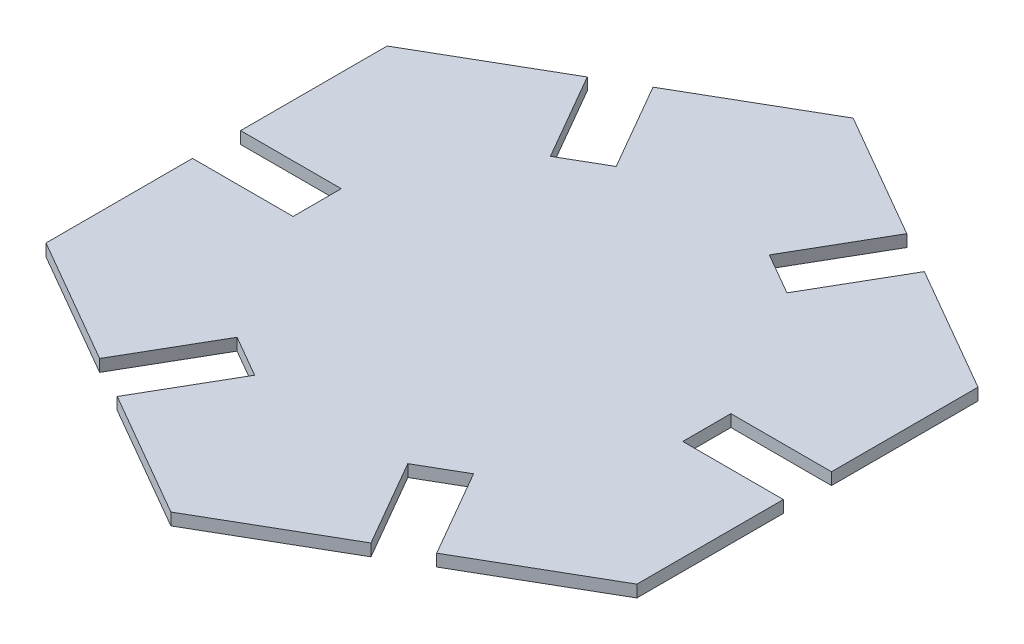
ISO-10303-21;
HEADER;
FILE_DESCRIPTION(('STEP AP214'),'2;1');
FILE_NAME('part.step','',(''),(''),'','','');
FILE_SCHEMA(('AUTOMOTIVE_DESIGN { 1 0 10303 214 1 1 1 1 }'));
ENDSEC;
DATA;
#1=APPLICATION_CONTEXT('core data for automotive mechanical design processes');
#2=APPLICATION_PROTOCOL_DEFINITION('international standard','automotive_design',2000,#1);
#3=PRODUCT_CONTEXT('',#1,'mechanical');
#4=PRODUCT('Part','Part','',(#3));
#5=PRODUCT_RELATED_PRODUCT_CATEGORY('part','',(#4));
#6=PRODUCT_DEFINITION_FORMATION('','',#4);
#7=PRODUCT_DEFINITION_CONTEXT('part definition',#1,'design');
#8=PRODUCT_DEFINITION('design','',#6,#7);
#9=PRODUCT_DEFINITION_SHAPE('','',#8);
#10=(LENGTH_UNIT() NAMED_UNIT(*) SI_UNIT(.MILLI.,.METRE.));
#11=(NAMED_UNIT(*) PLANE_ANGLE_UNIT() SI_UNIT($,.RADIAN.));
#12=(NAMED_UNIT(*) SI_UNIT($,.STERADIAN.) SOLID_ANGLE_UNIT());
#13=UNCERTAINTY_MEASURE_WITH_UNIT(LENGTH_MEASURE(1.E-05),#10,'distance_accuracy_value','');
#14=(GEOMETRIC_REPRESENTATION_CONTEXT(3) GLOBAL_UNCERTAINTY_ASSIGNED_CONTEXT((#13)) GLOBAL_UNIT_ASSIGNED_CONTEXT((#10,
#11,#12)) REPRESENTATION_CONTEXT('',''));
#15=CARTESIAN_POINT('',(0.,0.,0.));
#16=DIRECTION('',(0.,0.,1.));
#17=DIRECTION('',(1.,0.,0.));
#18=AXIS2_PLACEMENT_3D('',#15,#16,#17);
#19=CARTESIAN_POINT('',(26.2212155832334,1.5875,-24.6437931341085));
#20=DIRECTION('',(-0.5,0.,0.866025403784439));
#21=DIRECTION('',(0.866025403784439,0.,0.5));
#22=AXIS2_PLACEMENT_3D('',#19,#20,#21);
#23=PLANE('',#22);
#24=DIRECTION('',(-0.866025403784439,0.,-0.5));
#25=VECTOR('',#24,1.);
#26=CARTESIAN_POINT('',(26.2212155832334,1.5875,-24.6437931341085));
#27=LINE('',#26,#25);
#28=CARTESIAN_POINT('',(3.98601334106635,1.5875,-37.4812931341094));
#29=VERTEX_POINT('',#28);
#30=CARTESIAN_POINT('',(-12.7499275870663,1.5875,-47.1437931341085));
#31=VERTEX_POINT('',#30);
#32=EDGE_CURVE('E402',#29,#31,#27,.T.);
#33=ORIENTED_EDGE('',*,*,#32,.F.);
#34=DIRECTION('',(0.,1.,0.));
#35=VECTOR('',#34,1.);
#36=CARTESIAN_POINT('',(3.98601334106635,0.,-37.4812931341094));
#37=LINE('',#36,#35);
#38=CARTESIAN_POINT('',(3.98601334106635,0.,-37.4812931341094));
#39=VERTEX_POINT('',#38);
#40=EDGE_CURVE('E264',#39,#29,#37,.T.);
#41=ORIENTED_EDGE('',*,*,#40,.F.);
#42=DIRECTION('',(-0.866025403784439,0.,-0.5));
#43=VECTOR('',#42,1.);
#44=CARTESIAN_POINT('',(26.2212155832334,0.,-24.6437931341085));
#45=LINE('',#44,#43);
#46=CARTESIAN_POINT('',(-12.7499275870663,0.,-47.1437931341085));
#47=VERTEX_POINT('',#46);
#48=EDGE_CURVE('E268',#39,#47,#45,.T.);
#49=ORIENTED_EDGE('',*,*,#48,.T.);
#50=DIRECTION('',(0.,-1.,0.));
#51=VECTOR('',#50,1.);
#52=CARTESIAN_POINT('',(-12.7499275870663,1.5875,-47.1437931341085));
#53=LINE('',#52,#51);
#54=EDGE_CURVE('E11',#31,#47,#53,.T.);
#55=ORIENTED_EDGE('',*,*,#54,.F.);
#56=EDGE_LOOP('',(#33,#41,#49,#55));
#57=FACE_BOUND('',#56,.T.);
#58=ADVANCED_FACE('F39',(#57),#23,.F.);
#59=CARTESIAN_POINT('',(-12.7499275870663,1.5875,-47.1437931341085));
#60=DIRECTION('',(0.5,0.,0.866025403784438));
#61=DIRECTION('',(0.866025403784439,0.,-0.5));
#62=AXIS2_PLACEMENT_3D('',#59,#60,#61);
#63=PLANE('',#62);
#64=DIRECTION('',(-0.866025403784438,0.,0.5));
#65=VECTOR('',#64,1.);
#66=CARTESIAN_POINT('',(-12.7499275870663,1.5875,-47.1437931341085));
#67=LINE('',#66,#65);
#68=CARTESIAN_POINT('',(-34.9851298292254,1.5875,-34.3062931341122));
#69=VERTEX_POINT('',#68);
#70=CARTESIAN_POINT('',(-51.7210707573661,1.5875,-24.6437931341085));
#71=VERTEX_POINT('',#70);
#72=EDGE_CURVE('E401',#69,#71,#67,.T.);
#73=ORIENTED_EDGE('',*,*,#72,.F.);
#74=DIRECTION('',(0.,1.,0.));
#75=VECTOR('',#74,1.);
#76=CARTESIAN_POINT('',(-34.9851298292254,0.,-34.3062931341122));
#77=LINE('',#76,#75);
#78=CARTESIAN_POINT('',(-34.9851298292254,0.,-34.3062931341122));
#79=VERTEX_POINT('',#78);
#80=EDGE_CURVE('E314',#79,#69,#77,.T.);
#81=ORIENTED_EDGE('',*,*,#80,.F.);
#82=DIRECTION('',(-0.866025403784438,0.,0.5));
#83=VECTOR('',#82,1.);
#84=CARTESIAN_POINT('',(-12.7499275870663,0.,-47.1437931341085));
#85=LINE('',#84,#83);
#86=CARTESIAN_POINT('',(-51.7210707573661,0.,-24.6437931341085));
#87=VERTEX_POINT('',#86);
#88=EDGE_CURVE('E426',#79,#87,#85,.T.);
#89=ORIENTED_EDGE('',*,*,#88,.T.);
#90=DIRECTION('',(0.,-1.,0.));
#91=VECTOR('',#90,1.);
#92=CARTESIAN_POINT('',(-51.7210707573661,1.5875,-24.6437931341085));
#93=LINE('',#92,#91);
#94=EDGE_CURVE('E47',#71,#87,#93,.T.);
#95=ORIENTED_EDGE('',*,*,#94,.F.);
#96=EDGE_LOOP('',(#73,#81,#89,#95));
#97=FACE_BOUND('',#96,.T.);
#98=ADVANCED_FACE('F475',(#97),#63,.F.);
#99=CARTESIAN_POINT('',(-51.7210707573661,1.5875,-24.6437931341085));
#100=DIRECTION('',(1.,0.,0.));
#101=DIRECTION('',(0.,0.,-1.));
#102=AXIS2_PLACEMENT_3D('',#99,#100,#101);
#103=PLANE('',#102);
#104=DIRECTION('',(0.,0.,1.));
#105=VECTOR('',#104,1.);
#106=CARTESIAN_POINT('',(-51.7210707573661,1.5875,-24.6437931341085));
#107=LINE('',#106,#105);
#108=CARTESIAN_POINT('',(-51.7210707573661,1.5875,1.03120686588659));
#109=VERTEX_POINT('',#108);
#110=CARTESIAN_POINT('',(-51.7210707573661,1.5875,20.3562068658915));
#111=VERTEX_POINT('',#110);
#112=EDGE_CURVE('E406',#109,#111,#107,.T.);
#113=ORIENTED_EDGE('',*,*,#112,.F.);
#114=DIRECTION('',(0.,1.,0.));
#115=VECTOR('',#114,1.);
#116=CARTESIAN_POINT('',(-51.7210707573661,0.,1.03120686588659));
#117=LINE('',#116,#115);
#118=CARTESIAN_POINT('',(-51.7210707573661,0.,1.03120686588659));
#119=VERTEX_POINT('',#118);
#120=EDGE_CURVE('E370',#119,#109,#117,.T.);
#121=ORIENTED_EDGE('',*,*,#120,.F.);
#122=DIRECTION('',(0.,0.,1.));
#123=VECTOR('',#122,1.);
#124=CARTESIAN_POINT('',(-51.7210707573661,0.,-24.6437931341085));
#125=LINE('',#124,#123);
#126=CARTESIAN_POINT('',(-51.7210707573661,0.,20.3562068658915));
#127=VERTEX_POINT('',#126);
#128=EDGE_CURVE('E430',#119,#127,#125,.T.);
#129=ORIENTED_EDGE('',*,*,#128,.T.);
#130=DIRECTION('',(0.,-1.,0.));
#131=VECTOR('',#130,1.);
#132=CARTESIAN_POINT('',(-51.7210707573661,1.5875,20.3562068658915));
#133=LINE('',#132,#131);
#134=EDGE_CURVE('E453',#111,#127,#133,.T.);
#135=ORIENTED_EDGE('',*,*,#134,.F.);
#136=EDGE_LOOP('',(#113,#121,#129,#135));
#137=FACE_BOUND('',#136,.T.);
#138=ADVANCED_FACE('F561',(#137),#103,.F.);
#139=CARTESIAN_POINT('',(-51.7210707573661,1.5875,20.3562068658915));
#140=DIRECTION('',(0.5,0.,-0.866025403784439));
#141=DIRECTION('',(-0.866025403784439,0.,-0.5));
#142=AXIS2_PLACEMENT_3D('',#139,#140,#141);
#143=PLANE('',#142);
#144=DIRECTION('',(0.866025403784439,0.,0.5));
#145=VECTOR('',#144,1.);
#146=CARTESIAN_POINT('',(-51.7210707573661,1.5875,20.3562068658915));
#147=LINE('',#146,#145);
#148=CARTESIAN_POINT('',(-29.4858685152032,1.5875,33.19370686589));
#149=VERTEX_POINT('',#148);
#150=CARTESIAN_POINT('',(-12.7499275870663,1.5875,42.8562068658915));
#151=VERTEX_POINT('',#150);
#152=EDGE_CURVE('E410',#149,#151,#147,.T.);
#153=ORIENTED_EDGE('',*,*,#152,.F.);
#154=DIRECTION('',(0.,1.,0.));
#155=VECTOR('',#154,1.);
#156=CARTESIAN_POINT('',(-29.4858685152032,0.,33.19370686589));
#157=LINE('',#156,#155);
#158=CARTESIAN_POINT('',(-29.4858685152032,0.,33.19370686589));
#159=VERTEX_POINT('',#158);
#160=EDGE_CURVE('E293',#159,#149,#157,.T.);
#161=ORIENTED_EDGE('',*,*,#160,.F.);
#162=DIRECTION('',(0.866025403784439,0.,0.5));
#163=VECTOR('',#162,1.);
#164=CARTESIAN_POINT('',(-51.7210707573661,0.,20.3562068658915));
#165=LINE('',#164,#163);
#166=CARTESIAN_POINT('',(-12.7499275870663,0.,42.8562068658915));
#167=VERTEX_POINT('',#166);
#168=EDGE_CURVE('E434',#159,#167,#165,.T.);
#169=ORIENTED_EDGE('',*,*,#168,.T.);
#170=DIRECTION('',(0.,-1.,0.));
#171=VECTOR('',#170,1.);
#172=CARTESIAN_POINT('',(-12.7499275870663,1.5875,42.8562068658915));
#173=LINE('',#172,#171);
#174=EDGE_CURVE('E450',#151,#167,#173,.T.);
#175=ORIENTED_EDGE('',*,*,#174,.F.);
#176=EDGE_LOOP('',(#153,#161,#169,#175));
#177=FACE_BOUND('',#176,.T.);
#178=ADVANCED_FACE('F539',(#177),#143,.F.);
#179=CARTESIAN_POINT('',(-12.7499275870663,1.5875,42.8562068658915));
#180=DIRECTION('',(-0.5,0.,-0.866025403784439));
#181=DIRECTION('',(-0.866025403784439,0.,0.5));
#182=AXIS2_PLACEMENT_3D('',#179,#180,#181);
#183=PLANE('',#182);
#184=DIRECTION('',(0.866025403784439,0.,-0.5));
#185=VECTOR('',#184,1.);
#186=CARTESIAN_POINT('',(-12.7499275870663,1.5875,42.8562068658915));
#187=LINE('',#186,#185);
#188=CARTESIAN_POINT('',(9.48527465510291,1.5875,30.0187068658893));
#189=VERTEX_POINT('',#188);
#190=CARTESIAN_POINT('',(26.2212155832334,1.5875,20.3562068658915));
#191=VERTEX_POINT('',#190);
#192=EDGE_CURVE('E414',#189,#191,#187,.T.);
#193=ORIENTED_EDGE('',*,*,#192,.F.);
#194=DIRECTION('',(0.,1.,0.));
#195=VECTOR('',#194,1.);
#196=CARTESIAN_POINT('',(9.48527465510291,0.,30.0187068658893));
#197=LINE('',#196,#195);
#198=CARTESIAN_POINT('',(9.48527465510291,0.,30.0187068658893));
#199=VERTEX_POINT('',#198);
#200=EDGE_CURVE('E365',#199,#189,#197,.T.);
#201=ORIENTED_EDGE('',*,*,#200,.F.);
#202=DIRECTION('',(0.866025403784439,0.,-0.5));
#203=VECTOR('',#202,1.);
#204=CARTESIAN_POINT('',(-12.7499275870663,0.,42.8562068658915));
#205=LINE('',#204,#203);
#206=CARTESIAN_POINT('',(26.2212155832334,0.,20.3562068658915));
#207=VERTEX_POINT('',#206);
#208=EDGE_CURVE('E438',#199,#207,#205,.T.);
#209=ORIENTED_EDGE('',*,*,#208,.T.);
#210=DIRECTION('',(0.,-1.,0.));
#211=VECTOR('',#210,1.);
#212=CARTESIAN_POINT('',(26.2212155832334,1.5875,20.3562068658915));
#213=LINE('',#212,#211);
#214=EDGE_CURVE('E447',#191,#207,#213,.T.);
#215=ORIENTED_EDGE('',*,*,#214,.F.);
#216=EDGE_LOOP('',(#193,#201,#209,#215));
#217=FACE_BOUND('',#216,.T.);
#218=ADVANCED_FACE('F522',(#217),#183,.F.);
#219=CARTESIAN_POINT('',(26.2212155832334,1.5875,20.3562068658915));
#220=DIRECTION('',(-1.,0.,0.));
#221=DIRECTION('',(0.,0.,1.));
#222=AXIS2_PLACEMENT_3D('',#219,#220,#221);
#223=PLANE('',#222);
#224=DIRECTION('',(0.,0.,-1.));
#225=VECTOR('',#224,1.);
#226=CARTESIAN_POINT('',(26.2212155832334,1.5875,20.3562068658915));
#227=LINE('',#226,#225);
#228=CARTESIAN_POINT('',(26.2212155832334,1.5875,-5.31879313411646));
#229=VERTEX_POINT('',#228);
#230=CARTESIAN_POINT('',(26.2212155832334,1.5875,-24.6437931341085));
#231=VERTEX_POINT('',#230);
#232=EDGE_CURVE('E418',#229,#231,#227,.T.);
#233=ORIENTED_EDGE('',*,*,#232,.F.);
#234=DIRECTION('',(0.,1.,0.));
#235=VECTOR('',#234,1.);
#236=CARTESIAN_POINT('',(26.2212155832334,0.,-5.31879313411646));
#237=LINE('',#236,#235);
#238=CARTESIAN_POINT('',(26.2212155832334,0.,-5.31879313411646));
#239=VERTEX_POINT('',#238);
#240=EDGE_CURVE('E266',#239,#229,#237,.T.);
#241=ORIENTED_EDGE('',*,*,#240,.F.);
#242=DIRECTION('',(0.,0.,-1.));
#243=VECTOR('',#242,1.);
#244=CARTESIAN_POINT('',(26.2212155832334,0.,20.3562068658915));
#245=LINE('',#244,#243);
#246=CARTESIAN_POINT('',(26.2212155832334,0.,-24.6437931341085));
#247=VERTEX_POINT('',#246);
#248=EDGE_CURVE('E256',#239,#247,#245,.T.);
#249=ORIENTED_EDGE('',*,*,#248,.T.);
#250=DIRECTION('',(0.,-1.,0.));
#251=VECTOR('',#250,1.);
#252=CARTESIAN_POINT('',(26.2212155832334,1.5875,-24.6437931341085));
#253=LINE('',#252,#251);
#254=EDGE_CURVE('E422',#231,#247,#253,.T.);
#255=ORIENTED_EDGE('',*,*,#254,.F.);
#256=EDGE_LOOP('',(#233,#241,#249,#255));
#257=FACE_BOUND('',#256,.T.);
#258=ADVANCED_FACE('F510',(#257),#223,.F.);
#259=CARTESIAN_POINT('',(9.48527465509752,0.,-34.3062931341094));
#260=VERTEX_POINT('',#259);
#261=EDGE_CURVE('E423',#247,#260,#45,.T.);
#262=ORIENTED_EDGE('',*,*,#261,.T.);
#263=DIRECTION('',(0.,1.,0.));
#264=VECTOR('',#263,1.);
#265=CARTESIAN_POINT('',(9.48527465509752,0.,-34.3062931341094));
#266=LINE('',#265,#264);
#267=CARTESIAN_POINT('',(9.48527465509752,1.5875,-34.3062931341094));
#268=VERTEX_POINT('',#267);
#269=EDGE_CURVE('E319',#260,#268,#266,.T.);
#270=ORIENTED_EDGE('',*,*,#269,.T.);
#271=EDGE_CURVE('E398',#231,#268,#27,.T.);
#272=ORIENTED_EDGE('',*,*,#271,.F.);
#273=ORIENTED_EDGE('',*,*,#254,.T.);
#274=EDGE_LOOP('',(#262,#270,#272,#273));
#275=FACE_BOUND('',#274,.T.);
#276=ADVANCED_FACE('F41',(#275),#23,.F.);
#277=CARTESIAN_POINT('',(-29.4858685151943,0.,-37.4812931341122));
#278=VERTEX_POINT('',#277);
#279=EDGE_CURVE('E427',#47,#278,#85,.T.);
#280=ORIENTED_EDGE('',*,*,#279,.T.);
#281=DIRECTION('',(0.,1.,0.));
#282=VECTOR('',#281,1.);
#283=CARTESIAN_POINT('',(-29.4858685151943,0.,-37.4812931341122));
#284=LINE('',#283,#282);
#285=CARTESIAN_POINT('',(-29.4858685151943,1.5875,-37.4812931341122));
#286=VERTEX_POINT('',#285);
#287=EDGE_CURVE('E345',#278,#286,#284,.T.);
#288=ORIENTED_EDGE('',*,*,#287,.T.);
#289=EDGE_CURVE('E403',#31,#286,#67,.T.);
#290=ORIENTED_EDGE('',*,*,#289,.F.);
#291=ORIENTED_EDGE('',*,*,#54,.T.);
#292=EDGE_LOOP('',(#280,#288,#290,#291));
#293=FACE_BOUND('',#292,.T.);
#294=ADVANCED_FACE('F488',(#293),#63,.F.);
#295=CARTESIAN_POINT('',(-51.7210707573661,0.,-5.31879313411341));
#296=VERTEX_POINT('',#295);
#297=EDGE_CURVE('E431',#87,#296,#125,.T.);
#298=ORIENTED_EDGE('',*,*,#297,.T.);
#299=DIRECTION('',(0.,1.,0.));
#300=VECTOR('',#299,1.);
#301=CARTESIAN_POINT('',(-51.7210707573661,0.,-5.31879313411341));
#302=LINE('',#301,#300);
#303=CARTESIAN_POINT('',(-51.7210707573661,1.5875,-5.31879313411341));
#304=VERTEX_POINT('',#303);
#305=EDGE_CURVE('E372',#296,#304,#302,.T.);
#306=ORIENTED_EDGE('',*,*,#305,.T.);
#307=EDGE_CURVE('E407',#71,#304,#107,.T.);
#308=ORIENTED_EDGE('',*,*,#307,.F.);
#309=ORIENTED_EDGE('',*,*,#94,.T.);
#310=EDGE_LOOP('',(#298,#306,#308,#309));
#311=FACE_BOUND('',#310,.T.);
#312=ADVANCED_FACE('F460',(#311),#103,.F.);
#313=CARTESIAN_POINT('',(-34.9851298292344,0.,30.01870686589));
#314=VERTEX_POINT('',#313);
#315=EDGE_CURVE('E435',#127,#314,#165,.T.);
#316=ORIENTED_EDGE('',*,*,#315,.T.);
#317=DIRECTION('',(0.,1.,0.));
#318=VECTOR('',#317,1.);
#319=CARTESIAN_POINT('',(-34.9851298292344,0.,30.01870686589));
#320=LINE('',#319,#318);
#321=CARTESIAN_POINT('',(-34.9851298292344,1.5875,30.01870686589));
#322=VERTEX_POINT('',#321);
#323=EDGE_CURVE('E295',#314,#322,#320,.T.);
#324=ORIENTED_EDGE('',*,*,#323,.T.);
#325=EDGE_CURVE('E411',#111,#322,#147,.T.);
#326=ORIENTED_EDGE('',*,*,#325,.F.);
#327=ORIENTED_EDGE('',*,*,#134,.T.);
#328=EDGE_LOOP('',(#316,#324,#326,#327));
#329=FACE_BOUND('',#328,.T.);
#330=ADVANCED_FACE('F556',(#329),#143,.F.);
#331=CARTESIAN_POINT('',(3.98601334107111,0.,33.1937068658897));
#332=VERTEX_POINT('',#331);
#333=EDGE_CURVE('E439',#167,#332,#205,.T.);
#334=ORIENTED_EDGE('',*,*,#333,.T.);
#335=DIRECTION('',(0.,1.,0.));
#336=VECTOR('',#335,1.);
#337=CARTESIAN_POINT('',(3.98601334107111,0.,33.1937068658897));
#338=LINE('',#337,#336);
#339=CARTESIAN_POINT('',(3.98601334107111,1.5875,33.1937068658897));
#340=VERTEX_POINT('',#339);
#341=EDGE_CURVE('E392',#332,#340,#338,.T.);
#342=ORIENTED_EDGE('',*,*,#341,.T.);
#343=EDGE_CURVE('E415',#151,#340,#187,.T.);
#344=ORIENTED_EDGE('',*,*,#343,.F.);
#345=ORIENTED_EDGE('',*,*,#174,.T.);
#346=EDGE_LOOP('',(#334,#342,#344,#345));
#347=FACE_BOUND('',#346,.T.);
#348=ADVANCED_FACE('F534',(#347),#183,.F.);
#349=CARTESIAN_POINT('',(26.2212155832334,0.,1.03120686588354));
#350=VERTEX_POINT('',#349);
#351=EDGE_CURVE('E442',#207,#350,#245,.T.);
#352=ORIENTED_EDGE('',*,*,#351,.T.);
#353=DIRECTION('',(0.,1.,0.));
#354=VECTOR('',#353,1.);
#355=CARTESIAN_POINT('',(26.2212155832334,0.,1.03120686588354));
#356=LINE('',#355,#354);
#357=CARTESIAN_POINT('',(26.2212155832334,1.5875,1.03120686588354));
#358=VERTEX_POINT('',#357);
#359=EDGE_CURVE('E269',#350,#358,#356,.T.);
#360=ORIENTED_EDGE('',*,*,#359,.T.);
#361=EDGE_CURVE('E419',#191,#358,#227,.T.);
#362=ORIENTED_EDGE('',*,*,#361,.F.);
#363=ORIENTED_EDGE('',*,*,#214,.T.);
#364=EDGE_LOOP('',(#352,#360,#362,#363));
#365=FACE_BOUND('',#364,.T.);
#366=ADVANCED_FACE('F515',(#365),#223,.F.);
#367=CARTESIAN_POINT('',(0.,1.5875,0.));
#368=DIRECTION('',(0.,1.,0.));
#369=DIRECTION('',(0.,0.,1.));
#370=AXIS2_PLACEMENT_3D('',#367,#368,#369);
#371=PLANE('',#370);
#372=DIRECTION('',(-1.,0.,0.));
#373=VECTOR('',#372,1.);
#374=CARTESIAN_POINT('',(0.,1.5875,-5.31879313411646));
#375=LINE('',#374,#373);
#376=CARTESIAN_POINT('',(12.950072412932,1.5875,-5.31879313411646));
#377=VERTEX_POINT('',#376);
#378=EDGE_CURVE('E242',#229,#377,#375,.T.);
#379=ORIENTED_EDGE('',*,*,#378,.F.);
#380=ORIENTED_EDGE('',*,*,#232,.T.);
#381=ORIENTED_EDGE('',*,*,#271,.T.);
#382=DIRECTION('',(0.500000000000001,0.,-0.866025403784438));
#383=VECTOR('',#382,1.);
#384=CARTESIAN_POINT('',(-7.74110469058409,1.5875,-4.46932887693381));
#385=LINE('',#384,#383);
#386=CARTESIAN_POINT('',(2.8497030699489,1.5875,-22.8131460113717));
#387=VERTEX_POINT('',#386);
#388=EDGE_CURVE('E303',#387,#268,#385,.T.);
#389=ORIENTED_EDGE('',*,*,#388,.F.);
#390=DIRECTION('',(0.866025403784438,0.,0.5));
#391=VECTOR('',#390,1.);
#392=CARTESIAN_POINT('',(10.590807760533,1.5875,-18.3438171344379));
#393=LINE('',#392,#391);
#394=CARTESIAN_POINT('',(-2.64955824408227,1.5875,-25.9881460113717));
#395=VERTEX_POINT('',#394);
#396=EDGE_CURVE('E313',#395,#387,#393,.T.);
#397=ORIENTED_EDGE('',*,*,#396,.F.);
#398=DIRECTION('',(-0.5,0.,0.866025403784438));
#399=VECTOR('',#398,1.);
#400=CARTESIAN_POINT('',(-13.2403660046153,1.5875,-7.6443288769338));
#401=LINE('',#400,#399);
#402=EDGE_CURVE('E310',#29,#395,#401,.T.);
#403=ORIENTED_EDGE('',*,*,#402,.F.);
#404=ORIENTED_EDGE('',*,*,#32,.T.);
#405=ORIENTED_EDGE('',*,*,#289,.T.);
#406=DIRECTION('',(-0.499999999999999,0.,-0.866025403784439));
#407=VECTOR('',#406,1.);
#408=CARTESIAN_POINT('',(-5.88452537597954,1.5875,3.39743230987497));
#409=LINE('',#408,#407);
#410=CARTESIAN_POINT('',(-22.8502969300457,1.5875,-25.9881460113745));
#411=VERTEX_POINT('',#410);
#412=EDGE_CURVE('E329',#411,#286,#409,.T.);
#413=ORIENTED_EDGE('',*,*,#412,.F.);
#414=DIRECTION('',(0.866025403784439,0.,-0.5));
#415=VECTOR('',#414,1.);
#416=CARTESIAN_POINT('',(-16.9657715540662,1.5875,-29.3855783212494));
#417=LINE('',#416,#415);
#418=CARTESIAN_POINT('',(-28.3495582440768,1.5875,-22.8131460113745));
#419=VERTEX_POINT('',#418);
#420=EDGE_CURVE('E339',#419,#411,#417,.T.);
#421=ORIENTED_EDGE('',*,*,#420,.F.);
#422=DIRECTION('',(0.500000000000002,0.,0.866025403784438));
#423=VECTOR('',#422,1.);
#424=CARTESIAN_POINT('',(-11.3837866900106,1.5875,6.57243230987491));
#425=LINE('',#424,#423);
#426=EDGE_CURVE('E336',#69,#419,#425,.T.);
#427=ORIENTED_EDGE('',*,*,#426,.F.);
#428=ORIENTED_EDGE('',*,*,#72,.T.);
#429=ORIENTED_EDGE('',*,*,#307,.T.);
#430=DIRECTION('',(-1.,0.,0.));
#431=VECTOR('',#430,1.);
#432=CARTESIAN_POINT('',(0.,1.5875,-5.31879313411341));
#433=LINE('',#432,#431);
#434=CARTESIAN_POINT('',(-38.4499275870646,1.5875,-5.31879313411341));
#435=VERTEX_POINT('',#434);
#436=EDGE_CURVE('E364',#435,#304,#433,.T.);
#437=ORIENTED_EDGE('',*,*,#436,.F.);
#438=DIRECTION('',(0.,0.,1.));
#439=VECTOR('',#438,1.);
#440=CARTESIAN_POINT('',(-38.4499275870646,1.5875,0.));
#441=LINE('',#440,#439);
#442=CARTESIAN_POINT('',(-38.4499275870646,1.5875,1.03120686588659));
#443=VERTEX_POINT('',#442);
#444=EDGE_CURVE('E361',#435,#443,#441,.T.);
#445=ORIENTED_EDGE('',*,*,#444,.T.);
#446=DIRECTION('',(1.,0.,0.));
#447=VECTOR('',#446,1.);
#448=CARTESIAN_POINT('',(0.,1.5875,1.03120686588659));
#449=LINE('',#448,#447);
#450=EDGE_CURVE('E354',#109,#443,#449,.T.);
#451=ORIENTED_EDGE('',*,*,#450,.F.);
#452=ORIENTED_EDGE('',*,*,#112,.T.);
#453=ORIENTED_EDGE('',*,*,#325,.T.);
#454=DIRECTION('',(-0.500000000000011,0.,0.866025403784432));
#455=VECTOR('',#454,1.);
#456=CARTESIAN_POINT('',(-13.2403660046156,1.5875,-7.64432887693424));
#457=LINE('',#456,#455);
#458=CARTESIAN_POINT('',(-28.3495582440813,1.5875,18.5255597431448));
#459=VERTEX_POINT('',#458);
#460=EDGE_CURVE('E286',#459,#322,#457,.T.);
#461=ORIENTED_EDGE('',*,*,#460,.F.);
#462=DIRECTION('',(0.866025403784431,0.,0.500000000000013));
#463=VECTOR('',#462,1.);
#464=CARTESIAN_POINT('',(-15.1091922394657,1.5875,26.169888620079));
#465=LINE('',#464,#463);
#466=CARTESIAN_POINT('',(-22.8502969300502,1.5875,21.7005597431449));
#467=VERTEX_POINT('',#466);
#468=EDGE_CURVE('E283',#459,#467,#465,.T.);
#469=ORIENTED_EDGE('',*,*,#468,.T.);
#470=DIRECTION('',(0.500000000000011,0.,-0.866025403784432));
#471=VECTOR('',#470,1.);
#472=CARTESIAN_POINT('',(-7.74110469058454,1.5875,-4.46932887693419));
#473=LINE('',#472,#471);
#474=EDGE_CURVE('E276',#149,#467,#473,.T.);
#475=ORIENTED_EDGE('',*,*,#474,.F.);
#476=ORIENTED_EDGE('',*,*,#152,.T.);
#477=ORIENTED_EDGE('',*,*,#343,.T.);
#478=DIRECTION('',(0.499999999999977,0.,0.866025403784452));
#479=VECTOR('',#478,1.);
#480=CARTESIAN_POINT('',(-11.3837866900133,1.5875,6.57243230987607));
#481=LINE('',#480,#479);
#482=CARTESIAN_POINT('',(-2.64955824408365,1.5875,21.7005597431406));
#483=VERTEX_POINT('',#482);
#484=EDGE_CURVE('E380',#483,#340,#481,.T.);
#485=ORIENTED_EDGE('',*,*,#484,.F.);
#486=DIRECTION('',(-0.866025403784453,0.,0.499999999999975));
#487=VECTOR('',#486,1.);
#488=CARTESIAN_POINT('',(8.73422844592967,1.5875,15.1281274332645));
#489=LINE('',#488,#487);
#490=CARTESIAN_POINT('',(2.84970306994793,1.5875,18.5255597431405));
#491=VERTEX_POINT('',#490);
#492=EDGE_CURVE('E387',#491,#483,#489,.T.);
#493=ORIENTED_EDGE('',*,*,#492,.F.);
#494=DIRECTION('',(-0.5,0.,-0.866025403784439));
#495=VECTOR('',#494,1.);
#496=CARTESIAN_POINT('',(-5.88452537598207,1.5875,3.39743230987644));
#497=LINE('',#496,#495);
#498=EDGE_CURVE('E292',#189,#491,#497,.T.);
#499=ORIENTED_EDGE('',*,*,#498,.F.);
#500=ORIENTED_EDGE('',*,*,#192,.T.);
#501=ORIENTED_EDGE('',*,*,#361,.T.);
#502=DIRECTION('',(1.,0.,0.));
#503=VECTOR('',#502,1.);
#504=CARTESIAN_POINT('',(0.,1.5875,1.03120686588354));
#505=LINE('',#504,#503);
#506=CARTESIAN_POINT('',(12.950072412932,1.5875,1.03120686588354));
#507=VERTEX_POINT('',#506);
#508=EDGE_CURVE('E257',#507,#358,#505,.T.);
#509=ORIENTED_EDGE('',*,*,#508,.F.);
#510=DIRECTION('',(0.,0.,1.));
#511=VECTOR('',#510,1.);
#512=CARTESIAN_POINT('',(12.950072412932,1.5875,0.));
#513=LINE('',#512,#511);
#514=EDGE_CURVE('E259',#377,#507,#513,.T.);
#515=ORIENTED_EDGE('',*,*,#514,.F.);
#516=EDGE_LOOP('',(#379,#380,#381,#389,#397,#403,#404,#405,#413,#421,#427,#428,#429,#437,#445,
#451,#452,#453,#461,#469,#475,#476,#477,#485,#493,#499,#500,#501,#509,#515));
#517=FACE_BOUND('',#516,.T.);
#518=ADVANCED_FACE('F471',(#517),#371,.T.);
#519=CARTESIAN_POINT('',(0.,0.,0.));
#520=DIRECTION('',(0.,1.,0.));
#521=DIRECTION('',(0.,0.,1.));
#522=AXIS2_PLACEMENT_3D('',#519,#520,#521);
#523=PLANE('',#522);
#524=ORIENTED_EDGE('',*,*,#248,.F.);
#525=DIRECTION('',(-1.,0.,0.));
#526=VECTOR('',#525,1.);
#527=CARTESIAN_POINT('',(0.,0.,-5.31879313411646));
#528=LINE('',#527,#526);
#529=CARTESIAN_POINT('',(12.950072412932,0.,-5.31879313411646));
#530=VERTEX_POINT('',#529);
#531=EDGE_CURVE('E239',#239,#530,#528,.T.);
#532=ORIENTED_EDGE('',*,*,#531,.T.);
#533=DIRECTION('',(0.,0.,1.));
#534=VECTOR('',#533,1.);
#535=CARTESIAN_POINT('',(12.950072412932,0.,0.));
#536=LINE('',#535,#534);
#537=CARTESIAN_POINT('',(12.950072412932,0.,1.03120686588354));
#538=VERTEX_POINT('',#537);
#539=EDGE_CURVE('E249',#530,#538,#536,.T.);
#540=ORIENTED_EDGE('',*,*,#539,.T.);
#541=DIRECTION('',(1.,0.,0.));
#542=VECTOR('',#541,1.);
#543=CARTESIAN_POINT('',(0.,0.,1.03120686588354));
#544=LINE('',#543,#542);
#545=EDGE_CURVE('E54',#538,#350,#544,.T.);
#546=ORIENTED_EDGE('',*,*,#545,.T.);
#547=ORIENTED_EDGE('',*,*,#351,.F.);
#548=ORIENTED_EDGE('',*,*,#208,.F.);
#549=DIRECTION('',(-0.5,0.,-0.866025403784439));
#550=VECTOR('',#549,1.);
#551=CARTESIAN_POINT('',(-5.88452537598207,0.,3.39743230987644));
#552=LINE('',#551,#550);
#553=CARTESIAN_POINT('',(2.84970306994793,0.,18.5255597431405));
#554=VERTEX_POINT('',#553);
#555=EDGE_CURVE('E376',#199,#554,#552,.T.);
#556=ORIENTED_EDGE('',*,*,#555,.T.);
#557=DIRECTION('',(-0.866025403784453,0.,0.499999999999975));
#558=VECTOR('',#557,1.);
#559=CARTESIAN_POINT('',(8.73422844592967,0.,15.1281274332645));
#560=LINE('',#559,#558);
#561=CARTESIAN_POINT('',(-2.64955824408365,0.,21.7005597431406));
#562=VERTEX_POINT('',#561);
#563=EDGE_CURVE('E379',#554,#562,#560,.T.);
#564=ORIENTED_EDGE('',*,*,#563,.T.);
#565=DIRECTION('',(0.499999999999977,0.,0.866025403784452));
#566=VECTOR('',#565,1.);
#567=CARTESIAN_POINT('',(-11.3837866900133,0.,6.57243230987607));
#568=LINE('',#567,#566);
#569=EDGE_CURVE('E62',#562,#332,#568,.T.);
#570=ORIENTED_EDGE('',*,*,#569,.T.);
#571=ORIENTED_EDGE('',*,*,#333,.F.);
#572=ORIENTED_EDGE('',*,*,#168,.F.);
#573=DIRECTION('',(0.500000000000011,0.,-0.866025403784432));
#574=VECTOR('',#573,1.);
#575=CARTESIAN_POINT('',(-7.74110469058454,0.,-4.46932887693419));
#576=LINE('',#575,#574);
#577=CARTESIAN_POINT('',(-22.8502969300502,0.,21.7005597431449));
#578=VERTEX_POINT('',#577);
#579=EDGE_CURVE('E279',#159,#578,#576,.T.);
#580=ORIENTED_EDGE('',*,*,#579,.T.);
#581=DIRECTION('',(0.866025403784431,0.,0.500000000000013));
#582=VECTOR('',#581,1.);
#583=CARTESIAN_POINT('',(-15.1091922394657,0.,26.169888620079));
#584=LINE('',#583,#582);
#585=CARTESIAN_POINT('',(-28.3495582440813,0.,18.5255597431448));
#586=VERTEX_POINT('',#585);
#587=EDGE_CURVE('E273',#586,#578,#584,.T.);
#588=ORIENTED_EDGE('',*,*,#587,.F.);
#589=DIRECTION('',(-0.500000000000011,0.,0.866025403784432));
#590=VECTOR('',#589,1.);
#591=CARTESIAN_POINT('',(-13.2403660046156,0.,-7.64432887693424));
#592=LINE('',#591,#590);
#593=EDGE_CURVE('E275',#586,#314,#592,.T.);
#594=ORIENTED_EDGE('',*,*,#593,.T.);
#595=ORIENTED_EDGE('',*,*,#315,.F.);
#596=ORIENTED_EDGE('',*,*,#128,.F.);
#597=DIRECTION('',(1.,0.,0.));
#598=VECTOR('',#597,1.);
#599=CARTESIAN_POINT('',(0.,0.,1.03120686588659));
#600=LINE('',#599,#598);
#601=CARTESIAN_POINT('',(-38.4499275870646,0.,1.03120686588659));
#602=VERTEX_POINT('',#601);
#603=EDGE_CURVE('E357',#119,#602,#600,.T.);
#604=ORIENTED_EDGE('',*,*,#603,.T.);
#605=DIRECTION('',(0.,0.,1.));
#606=VECTOR('',#605,1.);
#607=CARTESIAN_POINT('',(-38.4499275870646,0.,0.));
#608=LINE('',#607,#606);
#609=CARTESIAN_POINT('',(-38.4499275870646,0.,-5.31879313411341));
#610=VERTEX_POINT('',#609);
#611=EDGE_CURVE('E351',#610,#602,#608,.T.);
#612=ORIENTED_EDGE('',*,*,#611,.F.);
#613=DIRECTION('',(-1.,0.,0.));
#614=VECTOR('',#613,1.);
#615=CARTESIAN_POINT('',(0.,0.,-5.31879313411341));
#616=LINE('',#615,#614);
#617=EDGE_CURVE('E353',#610,#296,#616,.T.);
#618=ORIENTED_EDGE('',*,*,#617,.T.);
#619=ORIENTED_EDGE('',*,*,#297,.F.);
#620=ORIENTED_EDGE('',*,*,#88,.F.);
#621=DIRECTION('',(0.500000000000002,0.,0.866025403784438));
#622=VECTOR('',#621,1.);
#623=CARTESIAN_POINT('',(-11.3837866900106,0.,6.57243230987491));
#624=LINE('',#623,#622);
#625=CARTESIAN_POINT('',(-28.3495582440768,0.,-22.8131460113745));
#626=VERTEX_POINT('',#625);
#627=EDGE_CURVE('E325',#79,#626,#624,.T.);
#628=ORIENTED_EDGE('',*,*,#627,.T.);
#629=DIRECTION('',(0.866025403784439,0.,-0.5));
#630=VECTOR('',#629,1.);
#631=CARTESIAN_POINT('',(-16.9657715540662,0.,-29.3855783212494));
#632=LINE('',#631,#630);
#633=CARTESIAN_POINT('',(-22.8502969300457,0.,-25.9881460113745));
#634=VERTEX_POINT('',#633);
#635=EDGE_CURVE('E328',#626,#634,#632,.T.);
#636=ORIENTED_EDGE('',*,*,#635,.T.);
#637=DIRECTION('',(-0.499999999999999,0.,-0.866025403784439));
#638=VECTOR('',#637,1.);
#639=CARTESIAN_POINT('',(-5.88452537597954,0.,3.39743230987497));
#640=LINE('',#639,#638);
#641=EDGE_CURVE('E332',#634,#278,#640,.T.);
#642=ORIENTED_EDGE('',*,*,#641,.T.);
#643=ORIENTED_EDGE('',*,*,#279,.F.);
#644=ORIENTED_EDGE('',*,*,#48,.F.);
#645=DIRECTION('',(-0.5,0.,0.866025403784438));
#646=VECTOR('',#645,1.);
#647=CARTESIAN_POINT('',(-13.2403660046153,0.,-7.6443288769338));
#648=LINE('',#647,#646);
#649=CARTESIAN_POINT('',(-2.64955824408227,0.,-25.9881460113717));
#650=VERTEX_POINT('',#649);
#651=EDGE_CURVE('E299',#39,#650,#648,.T.);
#652=ORIENTED_EDGE('',*,*,#651,.T.);
#653=DIRECTION('',(0.866025403784438,0.,0.5));
#654=VECTOR('',#653,1.);
#655=CARTESIAN_POINT('',(10.590807760533,0.,-18.3438171344379));
#656=LINE('',#655,#654);
#657=CARTESIAN_POINT('',(2.8497030699489,0.,-22.8131460113717));
#658=VERTEX_POINT('',#657);
#659=EDGE_CURVE('E302',#650,#658,#656,.T.);
#660=ORIENTED_EDGE('',*,*,#659,.T.);
#661=DIRECTION('',(0.500000000000001,0.,-0.866025403784438));
#662=VECTOR('',#661,1.);
#663=CARTESIAN_POINT('',(-7.74110469058409,0.,-4.46932887693381));
#664=LINE('',#663,#662);
#665=EDGE_CURVE('E306',#658,#260,#664,.T.);
#666=ORIENTED_EDGE('',*,*,#665,.T.);
#667=ORIENTED_EDGE('',*,*,#261,.F.);
#668=EDGE_LOOP('',(#524,#532,#540,#546,#547,#548,#556,#564,#570,#571,#572,#580,#588,#594,#595,
#596,#604,#612,#618,#619,#620,#628,#636,#642,#643,#644,#652,#660,#666,#667));
#669=FACE_BOUND('',#668,.T.);
#670=ADVANCED_FACE('F254',(#669),#523,.F.);
#671=CARTESIAN_POINT('',(-13.2403660046153,0.,-7.6443288769338));
#672=DIRECTION('',(-0.866025403784438,0.,-0.5));
#673=DIRECTION('',(-0.500000000000001,0.,0.866025403784438));
#674=AXIS2_PLACEMENT_3D('',#671,#672,#673);
#675=PLANE('',#674);
#676=ORIENTED_EDGE('',*,*,#402,.T.);
#677=DIRECTION('',(0.,1.,0.));
#678=VECTOR('',#677,1.);
#679=CARTESIAN_POINT('',(-2.64955824408227,0.,-25.9881460113717));
#680=LINE('',#679,#678);
#681=EDGE_CURVE('E309',#650,#395,#680,.T.);
#682=ORIENTED_EDGE('',*,*,#681,.F.);
#683=ORIENTED_EDGE('',*,*,#651,.F.);
#684=ORIENTED_EDGE('',*,*,#40,.T.);
#685=EDGE_LOOP('',(#676,#682,#683,#684));
#686=FACE_BOUND('',#685,.T.);
#687=ADVANCED_FACE('F498',(#686),#675,.F.);
#688=CARTESIAN_POINT('',(-7.74110469058409,0.,-4.46932887693381));
#689=DIRECTION('',(0.866025403784438,0.,0.500000000000001));
#690=DIRECTION('',(0.500000000000001,0.,-0.866025403784438));
#691=AXIS2_PLACEMENT_3D('',#688,#689,#690);
#692=PLANE('',#691);
#693=ORIENTED_EDGE('',*,*,#388,.T.);
#694=ORIENTED_EDGE('',*,*,#269,.F.);
#695=ORIENTED_EDGE('',*,*,#665,.F.);
#696=DIRECTION('',(0.,1.,0.));
#697=VECTOR('',#696,1.);
#698=CARTESIAN_POINT('',(2.8497030699489,0.,-22.8131460113717));
#699=LINE('',#698,#697);
#700=EDGE_CURVE('E322',#658,#387,#699,.T.);
#701=ORIENTED_EDGE('',*,*,#700,.T.);
#702=EDGE_LOOP('',(#693,#694,#695,#701));
#703=FACE_BOUND('',#702,.T.);
#704=ADVANCED_FACE('F504',(#703),#692,.F.);
#705=CARTESIAN_POINT('',(10.590807760533,0.,-18.3438171344379));
#706=DIRECTION('',(-0.5,0.,0.866025403784438));
#707=DIRECTION('',(0.866025403784438,0.,0.500000000000001));
#708=AXIS2_PLACEMENT_3D('',#705,#706,#707);
#709=PLANE('',#708);
#710=ORIENTED_EDGE('',*,*,#396,.T.);
#711=ORIENTED_EDGE('',*,*,#700,.F.);
#712=ORIENTED_EDGE('',*,*,#659,.F.);
#713=ORIENTED_EDGE('',*,*,#681,.T.);
#714=EDGE_LOOP('',(#710,#711,#712,#713));
#715=FACE_BOUND('',#714,.T.);
#716=ADVANCED_FACE('F501',(#715),#709,.F.);
#717=CARTESIAN_POINT('',(-11.3837866900106,0.,6.57243230987491));
#718=DIRECTION('',(-0.866025403784438,0.,0.500000000000002));
#719=DIRECTION('',(0.500000000000002,0.,0.866025403784438));
#720=AXIS2_PLACEMENT_3D('',#717,#718,#719);
#721=PLANE('',#720);
#722=ORIENTED_EDGE('',*,*,#426,.T.);
#723=DIRECTION('',(0.,1.,0.));
#724=VECTOR('',#723,1.);
#725=CARTESIAN_POINT('',(-28.3495582440768,0.,-22.8131460113745));
#726=LINE('',#725,#724);
#727=EDGE_CURVE('E335',#626,#419,#726,.T.);
#728=ORIENTED_EDGE('',*,*,#727,.F.);
#729=ORIENTED_EDGE('',*,*,#627,.F.);
#730=ORIENTED_EDGE('',*,*,#80,.T.);
#731=EDGE_LOOP('',(#722,#728,#729,#730));
#732=FACE_BOUND('',#731,.T.);
#733=ADVANCED_FACE('F477',(#732),#721,.F.);
#734=CARTESIAN_POINT('',(-5.88452537597954,0.,3.39743230987497));
#735=DIRECTION('',(0.866025403784439,0.,-0.499999999999999));
#736=DIRECTION('',(-0.499999999999999,0.,-0.866025403784439));
#737=AXIS2_PLACEMENT_3D('',#734,#735,#736);
#738=PLANE('',#737);
#739=ORIENTED_EDGE('',*,*,#412,.T.);
#740=ORIENTED_EDGE('',*,*,#287,.F.);
#741=ORIENTED_EDGE('',*,*,#641,.F.);
#742=DIRECTION('',(0.,1.,0.));
#743=VECTOR('',#742,1.);
#744=CARTESIAN_POINT('',(-22.8502969300457,0.,-25.9881460113745));
#745=LINE('',#744,#743);
#746=EDGE_CURVE('E348',#634,#411,#745,.T.);
#747=ORIENTED_EDGE('',*,*,#746,.T.);
#748=EDGE_LOOP('',(#739,#740,#741,#747));
#749=FACE_BOUND('',#748,.T.);
#750=ADVANCED_FACE('F485',(#749),#738,.F.);
#751=CARTESIAN_POINT('',(-16.9657715540662,0.,-29.3855783212494));
#752=DIRECTION('',(0.5,0.,0.866025403784439));
#753=DIRECTION('',(0.866025403784439,0.,-0.5));
#754=AXIS2_PLACEMENT_3D('',#751,#752,#753);
#755=PLANE('',#754);
#756=ORIENTED_EDGE('',*,*,#420,.T.);
#757=ORIENTED_EDGE('',*,*,#746,.F.);
#758=ORIENTED_EDGE('',*,*,#635,.F.);
#759=ORIENTED_EDGE('',*,*,#727,.T.);
#760=EDGE_LOOP('',(#756,#757,#758,#759));
#761=FACE_BOUND('',#760,.T.);
#762=ADVANCED_FACE('F482',(#761),#755,.F.);
#763=CARTESIAN_POINT('',(-38.4499275870646,0.,0.));
#764=DIRECTION('',(-1.,0.,0.));
#765=DIRECTION('',(0.,0.,1.));
#766=AXIS2_PLACEMENT_3D('',#763,#764,#765);
#767=PLANE('',#766);
#768=ORIENTED_EDGE('',*,*,#444,.F.);
#769=DIRECTION('',(0.,1.,0.));
#770=VECTOR('',#769,1.);
#771=CARTESIAN_POINT('',(-38.4499275870646,0.,-5.31879313411341));
#772=LINE('',#771,#770);
#773=EDGE_CURVE('E360',#610,#435,#772,.T.);
#774=ORIENTED_EDGE('',*,*,#773,.F.);
#775=ORIENTED_EDGE('',*,*,#611,.T.);
#776=DIRECTION('',(0.,1.,0.));
#777=VECTOR('',#776,1.);
#778=CARTESIAN_POINT('',(-38.4499275870646,0.,1.03120686588659));
#779=LINE('',#778,#777);
#780=EDGE_CURVE('E340',#602,#443,#779,.T.);
#781=ORIENTED_EDGE('',*,*,#780,.T.);
#782=EDGE_LOOP('',(#768,#774,#775,#781));
#783=FACE_BOUND('',#782,.T.);
#784=ADVANCED_FACE('F568',(#783),#767,.T.);
#785=CARTESIAN_POINT('',(0.,0.,1.03120686588659));
#786=DIRECTION('',(0.,0.,1.));
#787=DIRECTION('',(1.,0.,0.));
#788=AXIS2_PLACEMENT_3D('',#785,#786,#787);
#789=PLANE('',#788);
#790=ORIENTED_EDGE('',*,*,#450,.T.);
#791=ORIENTED_EDGE('',*,*,#780,.F.);
#792=ORIENTED_EDGE('',*,*,#603,.F.);
#793=ORIENTED_EDGE('',*,*,#120,.T.);
#794=EDGE_LOOP('',(#790,#791,#792,#793));
#795=FACE_BOUND('',#794,.T.);
#796=ADVANCED_FACE('F565',(#795),#789,.F.);
#797=CARTESIAN_POINT('',(0.,0.,-5.31879313411341));
#798=DIRECTION('',(0.,0.,-1.));
#799=DIRECTION('',(-1.,0.,0.));
#800=AXIS2_PLACEMENT_3D('',#797,#798,#799);
#801=PLANE('',#800);
#802=ORIENTED_EDGE('',*,*,#436,.T.);
#803=ORIENTED_EDGE('',*,*,#305,.F.);
#804=ORIENTED_EDGE('',*,*,#617,.F.);
#805=ORIENTED_EDGE('',*,*,#773,.T.);
#806=EDGE_LOOP('',(#802,#803,#804,#805));
#807=FACE_BOUND('',#806,.T.);
#808=ADVANCED_FACE('F467',(#807),#801,.F.);
#809=CARTESIAN_POINT('',(-5.88452537598207,0.,3.39743230987644));
#810=DIRECTION('',(0.866025403784439,0.,-0.5));
#811=DIRECTION('',(-0.5,0.,-0.866025403784439));
#812=AXIS2_PLACEMENT_3D('',#809,#810,#811);
#813=PLANE('',#812);
#814=ORIENTED_EDGE('',*,*,#498,.T.);
#815=DIRECTION('',(0.,1.,0.));
#816=VECTOR('',#815,1.);
#817=CARTESIAN_POINT('',(2.84970306994793,0.,18.5255597431405));
#818=LINE('',#817,#816);
#819=EDGE_CURVE('E384',#554,#491,#818,.T.);
#820=ORIENTED_EDGE('',*,*,#819,.F.);
#821=ORIENTED_EDGE('',*,*,#555,.F.);
#822=ORIENTED_EDGE('',*,*,#200,.T.);
#823=EDGE_LOOP('',(#814,#820,#821,#822));
#824=FACE_BOUND('',#823,.T.);
#825=ADVANCED_FACE('F525',(#824),#813,.F.);
#826=CARTESIAN_POINT('',(-11.3837866900133,0.,6.57243230987607));
#827=DIRECTION('',(-0.866025403784452,0.,0.499999999999977));
#828=DIRECTION('',(0.499999999999977,0.,0.866025403784452));
#829=AXIS2_PLACEMENT_3D('',#826,#827,#828);
#830=PLANE('',#829);
#831=ORIENTED_EDGE('',*,*,#484,.T.);
#832=ORIENTED_EDGE('',*,*,#341,.F.);
#833=ORIENTED_EDGE('',*,*,#569,.F.);
#834=DIRECTION('',(0.,1.,0.));
#835=VECTOR('',#834,1.);
#836=CARTESIAN_POINT('',(-2.64955824408365,0.,21.7005597431406));
#837=LINE('',#836,#835);
#838=EDGE_CURVE('E395',#562,#483,#837,.T.);
#839=ORIENTED_EDGE('',*,*,#838,.T.);
#840=EDGE_LOOP('',(#831,#832,#833,#839));
#841=FACE_BOUND('',#840,.T.);
#842=ADVANCED_FACE('F753',(#841),#830,.F.);
#843=CARTESIAN_POINT('',(8.73422844592967,0.,15.1281274332645));
#844=DIRECTION('',(-0.499999999999975,0.,-0.866025403784453));
#845=DIRECTION('',(-0.866025403784453,0.,0.499999999999975));
#846=AXIS2_PLACEMENT_3D('',#843,#844,#845);
#847=PLANE('',#846);
#848=ORIENTED_EDGE('',*,*,#492,.T.);
#849=ORIENTED_EDGE('',*,*,#838,.F.);
#850=ORIENTED_EDGE('',*,*,#563,.F.);
#851=ORIENTED_EDGE('',*,*,#819,.T.);
#852=EDGE_LOOP('',(#848,#849,#850,#851));
#853=FACE_BOUND('',#852,.T.);
#854=ADVANCED_FACE('F529',(#853),#847,.F.);
#855=CARTESIAN_POINT('',(-15.1091922394657,0.,26.169888620079));
#856=DIRECTION('',(-0.500000000000013,0.,0.866025403784431));
#857=DIRECTION('',(0.866025403784431,0.,0.500000000000013));
#858=AXIS2_PLACEMENT_3D('',#855,#856,#857);
#859=PLANE('',#858);
#860=ORIENTED_EDGE('',*,*,#468,.F.);
#861=DIRECTION('',(0.,1.,0.));
#862=VECTOR('',#861,1.);
#863=CARTESIAN_POINT('',(-28.3495582440813,0.,18.5255597431448));
#864=LINE('',#863,#862);
#865=EDGE_CURVE('E282',#586,#459,#864,.T.);
#866=ORIENTED_EDGE('',*,*,#865,.F.);
#867=ORIENTED_EDGE('',*,*,#587,.T.);
#868=DIRECTION('',(0.,1.,0.));
#869=VECTOR('',#868,1.);
#870=CARTESIAN_POINT('',(-22.8502969300502,0.,21.7005597431449));
#871=LINE('',#870,#869);
#872=EDGE_CURVE('E290',#578,#467,#871,.T.);
#873=ORIENTED_EDGE('',*,*,#872,.T.);
#874=EDGE_LOOP('',(#860,#866,#867,#873));
#875=FACE_BOUND('',#874,.T.);
#876=ADVANCED_FACE('F548',(#875),#859,.T.);
#877=CARTESIAN_POINT('',(-7.74110469058454,0.,-4.46932887693419));
#878=DIRECTION('',(0.866025403784432,0.,0.500000000000011));
#879=DIRECTION('',(0.500000000000011,0.,-0.866025403784432));
#880=AXIS2_PLACEMENT_3D('',#877,#878,#879);
#881=PLANE('',#880);
#882=ORIENTED_EDGE('',*,*,#474,.T.);
#883=ORIENTED_EDGE('',*,*,#872,.F.);
#884=ORIENTED_EDGE('',*,*,#579,.F.);
#885=ORIENTED_EDGE('',*,*,#160,.T.);
#886=EDGE_LOOP('',(#882,#883,#884,#885));
#887=FACE_BOUND('',#886,.T.);
#888=ADVANCED_FACE('F544',(#887),#881,.F.);
#889=CARTESIAN_POINT('',(-13.2403660046156,0.,-7.64432887693424));
#890=DIRECTION('',(-0.866025403784432,0.,-0.500000000000011));
#891=DIRECTION('',(-0.500000000000011,0.,0.866025403784432));
#892=AXIS2_PLACEMENT_3D('',#889,#890,#891);
#893=PLANE('',#892);
#894=ORIENTED_EDGE('',*,*,#460,.T.);
#895=ORIENTED_EDGE('',*,*,#323,.F.);
#896=ORIENTED_EDGE('',*,*,#593,.F.);
#897=ORIENTED_EDGE('',*,*,#865,.T.);
#898=EDGE_LOOP('',(#894,#895,#896,#897));
#899=FACE_BOUND('',#898,.T.);
#900=ADVANCED_FACE('F552',(#899),#893,.F.);
#901=CARTESIAN_POINT('',(0.,0.,-5.31879313411646));
#902=DIRECTION('',(0.,0.,-1.));
#903=DIRECTION('',(-1.,0.,0.));
#904=AXIS2_PLACEMENT_3D('',#901,#902,#903);
#905=PLANE('',#904);
#906=ORIENTED_EDGE('',*,*,#378,.T.);
#907=DIRECTION('',(0.,1.,0.));
#908=VECTOR('',#907,1.);
#909=CARTESIAN_POINT('',(12.950072412932,0.,-5.31879313411646));
#910=LINE('',#909,#908);
#911=EDGE_CURVE('E235',#530,#377,#910,.T.);
#912=ORIENTED_EDGE('',*,*,#911,.F.);
#913=ORIENTED_EDGE('',*,*,#531,.F.);
#914=ORIENTED_EDGE('',*,*,#240,.T.);
#915=EDGE_LOOP('',(#906,#912,#913,#914));
#916=FACE_BOUND('',#915,.T.);
#917=ADVANCED_FACE('F237',(#916),#905,.F.);
#918=CARTESIAN_POINT('',(0.,0.,1.03120686588354));
#919=DIRECTION('',(0.,0.,1.));
#920=DIRECTION('',(1.,0.,0.));
#921=AXIS2_PLACEMENT_3D('',#918,#919,#920);
#922=PLANE('',#921);
#923=ORIENTED_EDGE('',*,*,#508,.T.);
#924=ORIENTED_EDGE('',*,*,#359,.F.);
#925=ORIENTED_EDGE('',*,*,#545,.F.);
#926=DIRECTION('',(0.,1.,0.));
#927=VECTOR('',#926,1.);
#928=CARTESIAN_POINT('',(12.950072412932,0.,1.03120686588354));
#929=LINE('',#928,#927);
#930=EDGE_CURVE('E246',#538,#507,#929,.T.);
#931=ORIENTED_EDGE('',*,*,#930,.T.);
#932=EDGE_LOOP('',(#923,#924,#925,#931));
#933=FACE_BOUND('',#932,.T.);
#934=ADVANCED_FACE('F513',(#933),#922,.F.);
#935=CARTESIAN_POINT('',(12.950072412932,0.,0.));
#936=DIRECTION('',(-1.,0.,0.));
#937=DIRECTION('',(0.,0.,1.));
#938=AXIS2_PLACEMENT_3D('',#935,#936,#937);
#939=PLANE('',#938);
#940=ORIENTED_EDGE('',*,*,#514,.T.);
#941=ORIENTED_EDGE('',*,*,#930,.F.);
#942=ORIENTED_EDGE('',*,*,#539,.F.);
#943=ORIENTED_EDGE('',*,*,#911,.T.);
#944=EDGE_LOOP('',(#940,#941,#942,#943));
#945=FACE_BOUND('',#944,.T.);
#946=ADVANCED_FACE('F250',(#945),#939,.F.);
#947=CLOSED_SHELL('',(#58,#98,#138,#178,#218,#258,#276,#294,#312,#330,#348,#366,#518,#670,#687,
#704,#716,#733,#750,#762,#784,#796,#808,#825,#842,#854,#876,#888,#900,#917,#934,#946));
#948=MANIFOLD_SOLID_BREP('B2',#947);
#949=ADVANCED_BREP_SHAPE_REPRESENTATION('',(#18,#948),#14);
#950=SHAPE_DEFINITION_REPRESENTATION(#9,#949);
ENDSEC;
END-ISO-10303-21;
